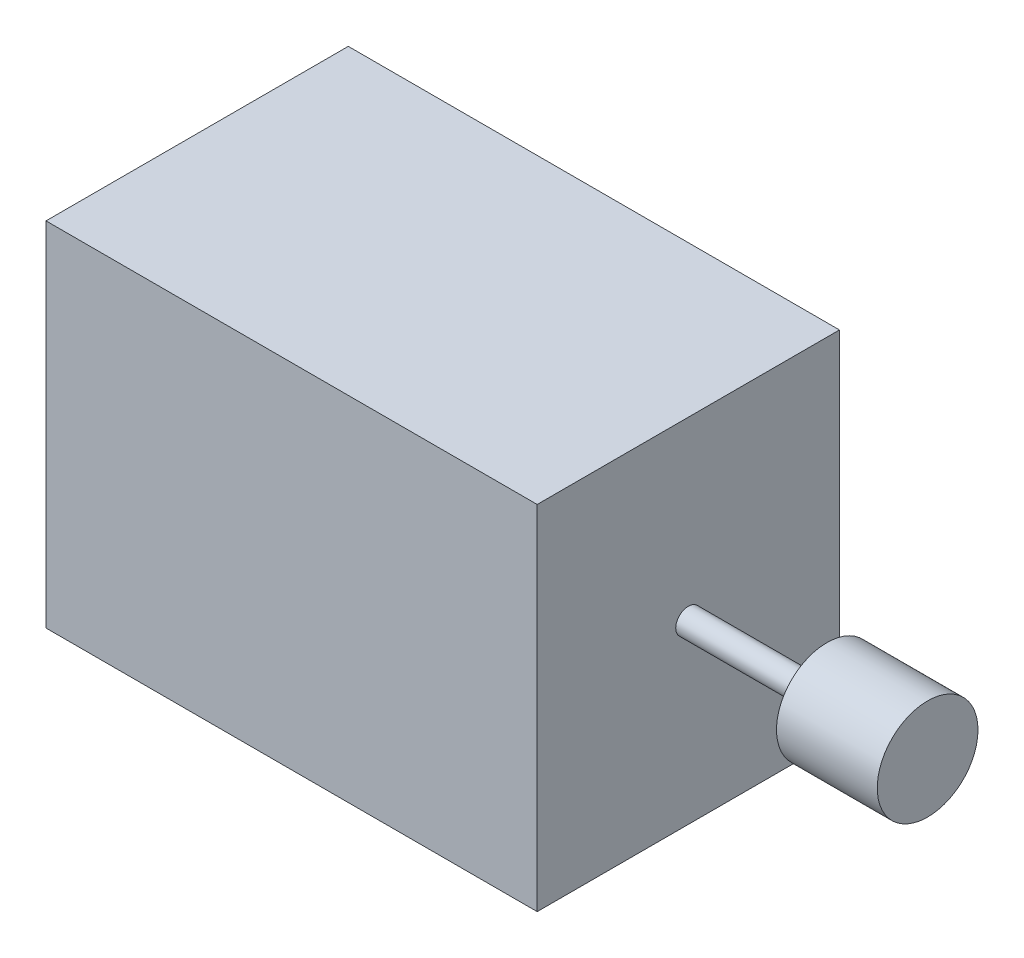
ISO-10303-21;
HEADER;
FILE_DESCRIPTION(('STEP AP214'),'2;1');
FILE_NAME('part.step','',(''),(''),'','','');
FILE_SCHEMA(('AUTOMOTIVE_DESIGN { 1 0 10303 214 1 1 1 1 }'));
ENDSEC;
DATA;
#1=APPLICATION_CONTEXT('core data for automotive mechanical design processes');
#2=APPLICATION_PROTOCOL_DEFINITION('international standard','automotive_design',2000,#1);
#3=PRODUCT_CONTEXT('',#1,'mechanical');
#4=PRODUCT('Part','Part','',(#3));
#5=PRODUCT_RELATED_PRODUCT_CATEGORY('part','',(#4));
#6=PRODUCT_DEFINITION_FORMATION('','',#4);
#7=PRODUCT_DEFINITION_CONTEXT('part definition',#1,'design');
#8=PRODUCT_DEFINITION('design','',#6,#7);
#9=PRODUCT_DEFINITION_SHAPE('','',#8);
#10=(LENGTH_UNIT() NAMED_UNIT(*) SI_UNIT(.MILLI.,.METRE.));
#11=(NAMED_UNIT(*) PLANE_ANGLE_UNIT() SI_UNIT($,.RADIAN.));
#12=(NAMED_UNIT(*) SI_UNIT($,.STERADIAN.) SOLID_ANGLE_UNIT());
#13=UNCERTAINTY_MEASURE_WITH_UNIT(LENGTH_MEASURE(1.E-05),#10,'distance_accuracy_value','');
#14=(GEOMETRIC_REPRESENTATION_CONTEXT(3) GLOBAL_UNCERTAINTY_ASSIGNED_CONTEXT((#13)) GLOBAL_UNIT_ASSIGNED_CONTEXT((#10,
#11,#12)) REPRESENTATION_CONTEXT('',''));
#15=CARTESIAN_POINT('',(0.,0.,0.));
#16=DIRECTION('',(0.,0.,1.));
#17=DIRECTION('',(1.,0.,0.));
#18=AXIS2_PLACEMENT_3D('',#15,#16,#17);
#19=CARTESIAN_POINT('',(19.5,14.,12.));
#20=DIRECTION('',(-1.,0.,0.));
#21=DIRECTION('',(0.,0.,1.));
#22=AXIS2_PLACEMENT_3D('',#19,#20,#21);
#23=PLANE('',#22);
#24=CARTESIAN_POINT('',(19.5,0.,0.));
#25=DIRECTION('',(-1.,0.,0.));
#26=DIRECTION('',(0.,0.,1.));
#27=AXIS2_PLACEMENT_3D('',#24,#25,#26);
#28=CIRCLE('',#27,1.);
#29=CARTESIAN_POINT('',(19.5,0.,1.));
#30=VERTEX_POINT('',#29);
#31=EDGE_CURVE('E11',#30,#30,#28,.F.);
#32=ORIENTED_EDGE('',*,*,#31,.F.);
#33=EDGE_LOOP('',(#32));
#34=FACE_BOUND('',#33,.T.);
#35=DIRECTION('',(0.,0.,-1.));
#36=VECTOR('',#35,1.);
#37=CARTESIAN_POINT('',(19.5,-14.,12.));
#38=LINE('',#37,#36);
#39=CARTESIAN_POINT('',(19.5,-14.,12.));
#40=VERTEX_POINT('',#39);
#41=CARTESIAN_POINT('',(19.5,-14.,-12.));
#42=VERTEX_POINT('',#41);
#43=EDGE_CURVE('E99',#40,#42,#38,.T.);
#44=ORIENTED_EDGE('',*,*,#43,.T.);
#45=DIRECTION('',(0.,-1.,0.));
#46=VECTOR('',#45,1.);
#47=CARTESIAN_POINT('',(19.5,14.,-12.));
#48=LINE('',#47,#46);
#49=CARTESIAN_POINT('',(19.5,14.,-12.));
#50=VERTEX_POINT('',#49);
#51=EDGE_CURVE('E41',#50,#42,#48,.T.);
#52=ORIENTED_EDGE('',*,*,#51,.F.);
#53=DIRECTION('',(0.,0.,-1.));
#54=VECTOR('',#53,1.);
#55=CARTESIAN_POINT('',(19.5,14.,12.));
#56=LINE('',#55,#54);
#57=CARTESIAN_POINT('',(19.5,14.,12.));
#58=VERTEX_POINT('',#57);
#59=EDGE_CURVE('E85',#58,#50,#56,.T.);
#60=ORIENTED_EDGE('',*,*,#59,.F.);
#61=DIRECTION('',(0.,-1.,0.));
#62=VECTOR('',#61,1.);
#63=CARTESIAN_POINT('',(19.5,14.,12.));
#64=LINE('',#63,#62);
#65=EDGE_CURVE('E95',#58,#40,#64,.T.);
#66=ORIENTED_EDGE('',*,*,#65,.T.);
#67=EDGE_LOOP('',(#44,#52,#60,#66));
#68=FACE_BOUND('',#67,.T.);
#69=ADVANCED_FACE('F33',(#34,#68),#23,.F.);
#70=CARTESIAN_POINT('',(-19.5,14.,-12.));
#71=DIRECTION('',(0.,0.,1.));
#72=DIRECTION('',(1.,0.,0.));
#73=AXIS2_PLACEMENT_3D('',#70,#71,#72);
#74=PLANE('',#73);
#75=DIRECTION('',(-1.,0.,0.));
#76=VECTOR('',#75,1.);
#77=CARTESIAN_POINT('',(-19.5,-14.,-12.));
#78=LINE('',#77,#76);
#79=CARTESIAN_POINT('',(-19.5,-14.,-12.));
#80=VERTEX_POINT('',#79);
#81=EDGE_CURVE('E90',#42,#80,#78,.T.);
#82=ORIENTED_EDGE('',*,*,#81,.T.);
#83=DIRECTION('',(0.,-1.,0.));
#84=VECTOR('',#83,1.);
#85=CARTESIAN_POINT('',(-19.5,14.,-12.));
#86=LINE('',#85,#84);
#87=CARTESIAN_POINT('',(-19.5,14.,-12.));
#88=VERTEX_POINT('',#87);
#89=EDGE_CURVE('E88',#88,#80,#86,.T.);
#90=ORIENTED_EDGE('',*,*,#89,.F.);
#91=DIRECTION('',(-1.,0.,0.));
#92=VECTOR('',#91,1.);
#93=CARTESIAN_POINT('',(-19.5,14.,-12.));
#94=LINE('',#93,#92);
#95=EDGE_CURVE('E80',#50,#88,#94,.T.);
#96=ORIENTED_EDGE('',*,*,#95,.F.);
#97=ORIENTED_EDGE('',*,*,#51,.T.);
#98=EDGE_LOOP('',(#82,#90,#96,#97));
#99=FACE_BOUND('',#98,.T.);
#100=ADVANCED_FACE('F89',(#99),#74,.F.);
#101=CARTESIAN_POINT('',(-19.5,14.,12.));
#102=DIRECTION('',(1.,0.,0.));
#103=DIRECTION('',(0.,0.,-1.));
#104=AXIS2_PLACEMENT_3D('',#101,#102,#103);
#105=PLANE('',#104);
#106=DIRECTION('',(0.,0.,1.));
#107=VECTOR('',#106,1.);
#108=CARTESIAN_POINT('',(-19.5,-14.,12.));
#109=LINE('',#108,#107);
#110=CARTESIAN_POINT('',(-19.5,-14.,12.));
#111=VERTEX_POINT('',#110);
#112=EDGE_CURVE('E66',#80,#111,#109,.T.);
#113=ORIENTED_EDGE('',*,*,#112,.T.);
#114=DIRECTION('',(0.,-1.,0.));
#115=VECTOR('',#114,1.);
#116=CARTESIAN_POINT('',(-19.5,14.,12.));
#117=LINE('',#116,#115);
#118=CARTESIAN_POINT('',(-19.5,14.,12.));
#119=VERTEX_POINT('',#118);
#120=EDGE_CURVE('E91',#119,#111,#117,.T.);
#121=ORIENTED_EDGE('',*,*,#120,.F.);
#122=DIRECTION('',(0.,0.,1.));
#123=VECTOR('',#122,1.);
#124=CARTESIAN_POINT('',(-19.5,14.,12.));
#125=LINE('',#124,#123);
#126=EDGE_CURVE('E83',#88,#119,#125,.T.);
#127=ORIENTED_EDGE('',*,*,#126,.F.);
#128=ORIENTED_EDGE('',*,*,#89,.T.);
#129=EDGE_LOOP('',(#113,#121,#127,#128));
#130=FACE_BOUND('',#129,.T.);
#131=ADVANCED_FACE('F93',(#130),#105,.F.);
#132=CARTESIAN_POINT('',(-19.5,14.,12.));
#133=DIRECTION('',(0.,0.,-1.));
#134=DIRECTION('',(-1.,0.,0.));
#135=AXIS2_PLACEMENT_3D('',#132,#133,#134);
#136=PLANE('',#135);
#137=DIRECTION('',(1.,0.,0.));
#138=VECTOR('',#137,1.);
#139=CARTESIAN_POINT('',(-19.5,-14.,12.));
#140=LINE('',#139,#138);
#141=EDGE_CURVE('E72',#111,#40,#140,.T.);
#142=ORIENTED_EDGE('',*,*,#141,.T.);
#143=ORIENTED_EDGE('',*,*,#65,.F.);
#144=DIRECTION('',(1.,0.,0.));
#145=VECTOR('',#144,1.);
#146=CARTESIAN_POINT('',(-19.5,14.,12.));
#147=LINE('',#146,#145);
#148=EDGE_CURVE('E49',#119,#58,#147,.T.);
#149=ORIENTED_EDGE('',*,*,#148,.F.);
#150=ORIENTED_EDGE('',*,*,#120,.T.);
#151=EDGE_LOOP('',(#142,#143,#149,#150));
#152=FACE_BOUND('',#151,.T.);
#153=ADVANCED_FACE('F122',(#152),#136,.F.);
#154=CARTESIAN_POINT('',(0.,14.,0.));
#155=DIRECTION('',(0.,-1.,0.));
#156=DIRECTION('',(0.,0.,-1.));
#157=AXIS2_PLACEMENT_3D('',#154,#155,#156);
#158=PLANE('',#157);
#159=ORIENTED_EDGE('',*,*,#59,.T.);
#160=ORIENTED_EDGE('',*,*,#95,.T.);
#161=ORIENTED_EDGE('',*,*,#126,.T.);
#162=ORIENTED_EDGE('',*,*,#148,.T.);
#163=EDGE_LOOP('',(#159,#160,#161,#162));
#164=FACE_BOUND('',#163,.T.);
#165=ADVANCED_FACE('F81',(#164),#158,.F.);
#166=CARTESIAN_POINT('',(0.,-14.,0.));
#167=DIRECTION('',(0.,-1.,0.));
#168=DIRECTION('',(0.,0.,-1.));
#169=AXIS2_PLACEMENT_3D('',#166,#167,#168);
#170=PLANE('',#169);
#171=CARTESIAN_POINT('',(-9.50000000000001,-14.,10.5));
#172=DIRECTION('',(0.,1.,0.));
#173=DIRECTION('',(0.,0.,1.));
#174=AXIS2_PLACEMENT_3D('',#171,#172,#173);
#175=CIRCLE('',#174,1.4);
#176=CARTESIAN_POINT('',(-9.50000000000001,-14.,11.9));
#177=VERTEX_POINT('',#176);
#178=EDGE_CURVE('E279',#177,#177,#175,.T.);
#179=ORIENTED_EDGE('',*,*,#178,.T.);
#180=EDGE_LOOP('',(#179));
#181=FACE_BOUND('',#180,.T.);
#182=CARTESIAN_POINT('',(9.49999999999999,-14.,-10.5));
#183=DIRECTION('',(0.,1.,0.));
#184=DIRECTION('',(0.,0.,1.));
#185=AXIS2_PLACEMENT_3D('',#182,#183,#184);
#186=CIRCLE('',#185,1.4);
#187=CARTESIAN_POINT('',(9.49999999999999,-14.,-9.1));
#188=VERTEX_POINT('',#187);
#189=EDGE_CURVE('E292',#188,#188,#186,.T.);
#190=ORIENTED_EDGE('',*,*,#189,.T.);
#191=EDGE_LOOP('',(#190));
#192=FACE_BOUND('',#191,.T.);
#193=CARTESIAN_POINT('',(9.49999999999999,-14.,10.5));
#194=DIRECTION('',(0.,1.,0.));
#195=DIRECTION('',(0.,0.,1.));
#196=AXIS2_PLACEMENT_3D('',#193,#194,#195);
#197=CIRCLE('',#196,1.4);
#198=CARTESIAN_POINT('',(9.49999999999999,-14.,11.9));
#199=VERTEX_POINT('',#198);
#200=EDGE_CURVE('E287',#199,#199,#197,.T.);
#201=ORIENTED_EDGE('',*,*,#200,.T.);
#202=EDGE_LOOP('',(#201));
#203=FACE_BOUND('',#202,.T.);
#204=CARTESIAN_POINT('',(-9.50000000000001,-14.,-10.5));
#205=DIRECTION('',(0.,1.,0.));
#206=DIRECTION('',(0.,0.,1.));
#207=AXIS2_PLACEMENT_3D('',#204,#205,#206);
#208=CIRCLE('',#207,1.4);
#209=CARTESIAN_POINT('',(-9.50000000000001,-14.,-9.1));
#210=VERTEX_POINT('',#209);
#211=EDGE_CURVE('E278',#210,#210,#208,.T.);
#212=ORIENTED_EDGE('',*,*,#211,.T.);
#213=EDGE_LOOP('',(#212));
#214=FACE_BOUND('',#213,.T.);
#215=ORIENTED_EDGE('',*,*,#43,.F.);
#216=ORIENTED_EDGE('',*,*,#141,.F.);
#217=ORIENTED_EDGE('',*,*,#112,.F.);
#218=ORIENTED_EDGE('',*,*,#81,.F.);
#219=EDGE_LOOP('',(#215,#216,#217,#218));
#220=FACE_BOUND('',#219,.T.);
#221=ADVANCED_FACE('F110',(#181,#192,#203,#214,#220),#170,.T.);
#222=CARTESIAN_POINT('',(30.5,0.,0.));
#223=DIRECTION('',(-1.,0.,0.));
#224=DIRECTION('',(0.,0.,1.));
#225=AXIS2_PLACEMENT_3D('',#222,#223,#224);
#226=CYLINDRICAL_SURFACE('',#225,1.);
#227=CARTESIAN_POINT('',(30.5,0.,0.));
#228=DIRECTION('',(1.,0.,0.));
#229=DIRECTION('',(0.,0.,-1.));
#230=AXIS2_PLACEMENT_3D('',#227,#228,#229);
#231=CIRCLE('',#230,1.);
#232=CARTESIAN_POINT('',(30.5,0.,-1.));
#233=VERTEX_POINT('',#232);
#234=EDGE_CURVE('E102',#233,#233,#231,.T.);
#235=ORIENTED_EDGE('',*,*,#234,.F.);
#236=EDGE_LOOP('',(#235));
#237=FACE_BOUND('',#236,.T.);
#238=ORIENTED_EDGE('',*,*,#31,.T.);
#239=EDGE_LOOP('',(#238));
#240=FACE_BOUND('',#239,.T.);
#241=ADVANCED_FACE('F112',(#237,#240),#226,.T.);
#242=CARTESIAN_POINT('',(38.5,0.,0.));
#243=DIRECTION('',(-1.,0.,0.));
#244=DIRECTION('',(0.,0.,1.));
#245=AXIS2_PLACEMENT_3D('',#242,#243,#244);
#246=CYLINDRICAL_SURFACE('',#245,4.);
#247=CARTESIAN_POINT('',(38.5,0.,0.));
#248=DIRECTION('',(1.,0.,0.));
#249=DIRECTION('',(0.,0.,-1.));
#250=AXIS2_PLACEMENT_3D('',#247,#248,#249);
#251=CIRCLE('',#250,4.);
#252=CARTESIAN_POINT('',(38.5,0.,-4.));
#253=VERTEX_POINT('',#252);
#254=EDGE_CURVE('E299',#253,#253,#251,.T.);
#255=ORIENTED_EDGE('',*,*,#254,.F.);
#256=EDGE_LOOP('',(#255));
#257=FACE_BOUND('',#256,.T.);
#258=CARTESIAN_POINT('',(30.5,0.,0.));
#259=DIRECTION('',(1.,0.,0.));
#260=DIRECTION('',(0.,0.,-1.));
#261=AXIS2_PLACEMENT_3D('',#258,#259,#260);
#262=CIRCLE('',#261,4.);
#263=CARTESIAN_POINT('',(30.5,0.,-4.));
#264=VERTEX_POINT('',#263);
#265=EDGE_CURVE('E297',#264,#264,#262,.T.);
#266=ORIENTED_EDGE('',*,*,#265,.T.);
#267=EDGE_LOOP('',(#266));
#268=FACE_BOUND('',#267,.T.);
#269=ADVANCED_FACE('F119',(#257,#268),#246,.T.);
#270=CARTESIAN_POINT('',(38.5,0.,0.));
#271=DIRECTION('',(1.,0.,0.));
#272=DIRECTION('',(0.,0.,-1.));
#273=AXIS2_PLACEMENT_3D('',#270,#271,#272);
#274=PLANE('',#273);
#275=ORIENTED_EDGE('',*,*,#254,.T.);
#276=EDGE_LOOP('',(#275));
#277=FACE_BOUND('',#276,.T.);
#278=ADVANCED_FACE('F168',(#277),#274,.T.);
#279=CARTESIAN_POINT('',(30.5,0.,0.));
#280=DIRECTION('',(1.,0.,0.));
#281=DIRECTION('',(0.,0.,-1.));
#282=AXIS2_PLACEMENT_3D('',#279,#280,#281);
#283=PLANE('',#282);
#284=ORIENTED_EDGE('',*,*,#234,.T.);
#285=EDGE_LOOP('',(#284));
#286=FACE_BOUND('',#285,.T.);
#287=ORIENTED_EDGE('',*,*,#265,.F.);
#288=EDGE_LOOP('',(#287));
#289=FACE_BOUND('',#288,.T.);
#290=ADVANCED_FACE('F178',(#286,#289),#283,.F.);
#291=CARTESIAN_POINT('',(-9.50000000000001,-6.,-10.5));
#292=DIRECTION('',(0.,-1.,0.));
#293=DIRECTION('',(0.,0.,-1.));
#294=AXIS2_PLACEMENT_3D('',#291,#292,#293);
#295=CYLINDRICAL_SURFACE('',#294,1.4);
#296=CARTESIAN_POINT('',(-9.50000000000001,-6.,-10.5));
#297=DIRECTION('',(0.,1.,0.));
#298=DIRECTION('',(0.,0.,1.));
#299=AXIS2_PLACEMENT_3D('',#296,#297,#298);
#300=CIRCLE('',#299,1.4);
#301=CARTESIAN_POINT('',(-9.50000000000001,-6.,-9.1));
#302=VERTEX_POINT('',#301);
#303=EDGE_CURVE('E282',#302,#302,#300,.T.);
#304=ORIENTED_EDGE('',*,*,#303,.T.);
#305=EDGE_LOOP('',(#304));
#306=FACE_BOUND('',#305,.T.);
#307=ORIENTED_EDGE('',*,*,#211,.F.);
#308=EDGE_LOOP('',(#307));
#309=FACE_BOUND('',#308,.T.);
#310=ADVANCED_FACE('F187',(#306,#309),#295,.F.);
#311=CARTESIAN_POINT('',(-9.50000000000001,-6.,-10.5));
#312=DIRECTION('',(0.,1.,0.));
#313=DIRECTION('',(0.,0.,1.));
#314=AXIS2_PLACEMENT_3D('',#311,#312,#313);
#315=PLANE('',#314);
#316=ORIENTED_EDGE('',*,*,#303,.F.);
#317=EDGE_LOOP('',(#316));
#318=FACE_BOUND('',#317,.T.);
#319=ADVANCED_FACE('F201',(#318),#315,.F.);
#320=CARTESIAN_POINT('',(9.49999999999999,-6.,10.5));
#321=DIRECTION('',(0.,-1.,0.));
#322=DIRECTION('',(0.,0.,-1.));
#323=AXIS2_PLACEMENT_3D('',#320,#321,#322);
#324=CYLINDRICAL_SURFACE('',#323,1.4);
#325=CARTESIAN_POINT('',(9.49999999999999,-6.,10.5));
#326=DIRECTION('',(0.,1.,0.));
#327=DIRECTION('',(0.,0.,1.));
#328=AXIS2_PLACEMENT_3D('',#325,#326,#327);
#329=CIRCLE('',#328,1.4);
#330=CARTESIAN_POINT('',(9.49999999999999,-6.,11.9));
#331=VERTEX_POINT('',#330);
#332=EDGE_CURVE('E295',#331,#331,#329,.T.);
#333=ORIENTED_EDGE('',*,*,#332,.T.);
#334=EDGE_LOOP('',(#333));
#335=FACE_BOUND('',#334,.T.);
#336=ORIENTED_EDGE('',*,*,#200,.F.);
#337=EDGE_LOOP('',(#336));
#338=FACE_BOUND('',#337,.T.);
#339=ADVANCED_FACE('F211',(#335,#338),#324,.F.);
#340=CARTESIAN_POINT('',(9.49999999999999,-6.,10.5));
#341=DIRECTION('',(0.,1.,0.));
#342=DIRECTION('',(0.,0.,1.));
#343=AXIS2_PLACEMENT_3D('',#340,#341,#342);
#344=PLANE('',#343);
#345=ORIENTED_EDGE('',*,*,#332,.F.);
#346=EDGE_LOOP('',(#345));
#347=FACE_BOUND('',#346,.T.);
#348=ADVANCED_FACE('F221',(#347),#344,.F.);
#349=CARTESIAN_POINT('',(9.49999999999999,-6.,-10.5));
#350=DIRECTION('',(0.,-1.,0.));
#351=DIRECTION('',(0.,0.,-1.));
#352=AXIS2_PLACEMENT_3D('',#349,#350,#351);
#353=CYLINDRICAL_SURFACE('',#352,1.4);
#354=CARTESIAN_POINT('',(9.49999999999999,-6.,-10.5));
#355=DIRECTION('',(0.,1.,0.));
#356=DIRECTION('',(0.,0.,1.));
#357=AXIS2_PLACEMENT_3D('',#354,#355,#356);
#358=CIRCLE('',#357,1.4);
#359=CARTESIAN_POINT('',(9.49999999999999,-6.,-9.1));
#360=VERTEX_POINT('',#359);
#361=EDGE_CURVE('E284',#360,#360,#358,.T.);
#362=ORIENTED_EDGE('',*,*,#361,.T.);
#363=EDGE_LOOP('',(#362));
#364=FACE_BOUND('',#363,.T.);
#365=ORIENTED_EDGE('',*,*,#189,.F.);
#366=EDGE_LOOP('',(#365));
#367=FACE_BOUND('',#366,.T.);
#368=ADVANCED_FACE('F231',(#364,#367),#353,.F.);
#369=CARTESIAN_POINT('',(9.49999999999999,-6.,-10.5));
#370=DIRECTION('',(0.,1.,0.));
#371=DIRECTION('',(0.,0.,1.));
#372=AXIS2_PLACEMENT_3D('',#369,#370,#371);
#373=PLANE('',#372);
#374=ORIENTED_EDGE('',*,*,#361,.F.);
#375=EDGE_LOOP('',(#374));
#376=FACE_BOUND('',#375,.T.);
#377=ADVANCED_FACE('F241',(#376),#373,.F.);
#378=CARTESIAN_POINT('',(-9.50000000000001,-6.,10.5));
#379=DIRECTION('',(0.,-1.,0.));
#380=DIRECTION('',(0.,0.,-1.));
#381=AXIS2_PLACEMENT_3D('',#378,#379,#380);
#382=CYLINDRICAL_SURFACE('',#381,1.4);
#383=CARTESIAN_POINT('',(-9.50000000000001,-6.,10.5));
#384=DIRECTION('',(0.,1.,0.));
#385=DIRECTION('',(0.,0.,1.));
#386=AXIS2_PLACEMENT_3D('',#383,#384,#385);
#387=CIRCLE('',#386,1.4);
#388=CARTESIAN_POINT('',(-9.50000000000001,-6.,11.9));
#389=VERTEX_POINT('',#388);
#390=EDGE_CURVE('E277',#389,#389,#387,.T.);
#391=ORIENTED_EDGE('',*,*,#390,.T.);
#392=EDGE_LOOP('',(#391));
#393=FACE_BOUND('',#392,.T.);
#394=ORIENTED_EDGE('',*,*,#178,.F.);
#395=EDGE_LOOP('',(#394));
#396=FACE_BOUND('',#395,.T.);
#397=ADVANCED_FACE('F251',(#393,#396),#382,.F.);
#398=CARTESIAN_POINT('',(-9.50000000000001,-6.,10.5));
#399=DIRECTION('',(0.,1.,0.));
#400=DIRECTION('',(0.,0.,1.));
#401=AXIS2_PLACEMENT_3D('',#398,#399,#400);
#402=PLANE('',#401);
#403=ORIENTED_EDGE('',*,*,#390,.F.);
#404=EDGE_LOOP('',(#403));
#405=FACE_BOUND('',#404,.T.);
#406=ADVANCED_FACE('F261',(#405),#402,.F.);
#407=CLOSED_SHELL('',(#69,#100,#131,#153,#165,#221,#241,#269,#278,#290,#310,#319,#339,#348,#368,
#377,#397,#406));
#408=MANIFOLD_SOLID_BREP('B2',#407);
#409=ADVANCED_BREP_SHAPE_REPRESENTATION('',(#18,#408),#14);
#410=SHAPE_DEFINITION_REPRESENTATION(#9,#409);
ENDSEC;
END-ISO-10303-21;
